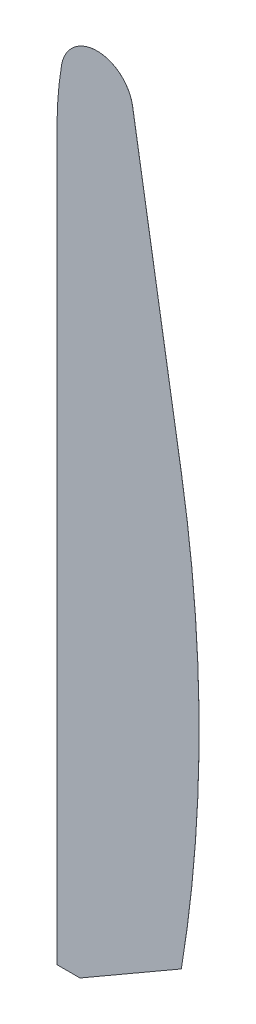
ISO-10303-21;
HEADER;
FILE_DESCRIPTION(('STEP AP214'),'2;1');
FILE_NAME('part.step','',(''),(''),'','','');
FILE_SCHEMA(('AUTOMOTIVE_DESIGN { 1 0 10303 214 1 1 1 1 }'));
ENDSEC;
DATA;
#1=APPLICATION_CONTEXT('core data for automotive mechanical design processes');
#2=APPLICATION_PROTOCOL_DEFINITION('international standard','automotive_design',2000,#1);
#3=PRODUCT_CONTEXT('',#1,'mechanical');
#4=PRODUCT('Part','Part','',(#3));
#5=PRODUCT_RELATED_PRODUCT_CATEGORY('part','',(#4));
#6=PRODUCT_DEFINITION_FORMATION('','',#4);
#7=PRODUCT_DEFINITION_CONTEXT('part definition',#1,'design');
#8=PRODUCT_DEFINITION('design','',#6,#7);
#9=PRODUCT_DEFINITION_SHAPE('','',#8);
#10=(LENGTH_UNIT() NAMED_UNIT(*) SI_UNIT(.MILLI.,.METRE.));
#11=(NAMED_UNIT(*) PLANE_ANGLE_UNIT() SI_UNIT($,.RADIAN.));
#12=(NAMED_UNIT(*) SI_UNIT($,.STERADIAN.) SOLID_ANGLE_UNIT());
#13=UNCERTAINTY_MEASURE_WITH_UNIT(LENGTH_MEASURE(1.E-05),#10,'distance_accuracy_value','');
#14=(GEOMETRIC_REPRESENTATION_CONTEXT(3) GLOBAL_UNCERTAINTY_ASSIGNED_CONTEXT((#13)) GLOBAL_UNIT_ASSIGNED_CONTEXT((#10,
#11,#12)) REPRESENTATION_CONTEXT('',''));
#15=CARTESIAN_POINT('',(0.,0.,0.));
#16=DIRECTION('',(0.,0.,1.));
#17=DIRECTION('',(1.,0.,0.));
#18=AXIS2_PLACEMENT_3D('',#15,#16,#17);
#19=CARTESIAN_POINT('',(8.71053174210325,168.714262265453,0.01));
#20=DIRECTION('',(0.,0.,-1.));
#21=DIRECTION('',(-1.,0.,0.));
#22=AXIS2_PLACEMENT_3D('',#19,#20,#21);
#23=CYLINDRICAL_SURFACE('',#22,7.83350913216335);
#24=CARTESIAN_POINT('',(8.71053174210325,168.714262265453,0.));
#25=DIRECTION('',(0.,0.,-1.));
#26=DIRECTION('',(-1.,0.,0.));
#27=AXIS2_PLACEMENT_3D('',#24,#25,#26);
#28=CIRCLE('',#27,7.83350913216335);
#29=CARTESIAN_POINT('',(0.983259014830762,170.,0.));
#30=VERTEX_POINT('',#29);
#31=CARTESIAN_POINT('',(16.4378044693758,170.,0.));
#32=VERTEX_POINT('',#31);
#33=EDGE_CURVE('E129',#30,#32,#28,.T.);
#34=ORIENTED_EDGE('',*,*,#33,.F.);
#35=DIRECTION('',(0.,0.,-1.));
#36=VECTOR('',#35,1.);
#37=CARTESIAN_POINT('',(0.983259014830762,170.,0.01));
#38=LINE('',#37,#36);
#39=CARTESIAN_POINT('',(0.983259014830762,170.,0.01));
#40=VERTEX_POINT('',#39);
#41=EDGE_CURVE('E11',#40,#30,#38,.T.);
#42=ORIENTED_EDGE('',*,*,#41,.F.);
#43=CARTESIAN_POINT('',(8.71053174210325,168.714262265453,0.01));
#44=DIRECTION('',(0.,0.,-1.));
#45=DIRECTION('',(-1.,0.,0.));
#46=AXIS2_PLACEMENT_3D('',#43,#44,#45);
#47=CIRCLE('',#46,7.83350913216335);
#48=CARTESIAN_POINT('',(16.4378044693758,170.,0.01));
#49=VERTEX_POINT('',#48);
#50=EDGE_CURVE('E144',#40,#49,#47,.T.);
#51=ORIENTED_EDGE('',*,*,#50,.T.);
#52=DIRECTION('',(0.,0.,-1.));
#53=VECTOR('',#52,1.);
#54=CARTESIAN_POINT('',(16.4378044693758,170.,0.01));
#55=LINE('',#54,#53);
#56=EDGE_CURVE('E42',#49,#32,#55,.T.);
#57=ORIENTED_EDGE('',*,*,#56,.T.);
#58=EDGE_LOOP('',(#34,#42,#51,#57));
#59=FACE_BOUND('',#58,.T.);
#60=ADVANCED_FACE('F41',(#59),#23,.T.);
#61=CARTESIAN_POINT('',(72.5021566747534,158.1,0.01));
#62=DIRECTION('',(0.,0.,-1.));
#63=DIRECTION('',(-1.,0.,0.));
#64=AXIS2_PLACEMENT_3D('',#61,#62,#63);
#65=CYLINDRICAL_SURFACE('',#64,72.5021566747534);
#66=CARTESIAN_POINT('',(72.5021566747534,158.1,0.));
#67=DIRECTION('',(0.,0.,-1.));
#68=DIRECTION('',(-1.,0.,0.));
#69=AXIS2_PLACEMENT_3D('',#66,#67,#68);
#70=CIRCLE('',#69,72.5021566747534);
#71=CARTESIAN_POINT('',(0.,158.1,0.));
#72=VERTEX_POINT('',#71);
#73=EDGE_CURVE('E141',#72,#30,#70,.T.);
#74=ORIENTED_EDGE('',*,*,#73,.F.);
#75=DIRECTION('',(0.,0.,-1.));
#76=VECTOR('',#75,1.);
#77=CARTESIAN_POINT('',(0.,158.1,0.01));
#78=LINE('',#77,#76);
#79=CARTESIAN_POINT('',(0.,158.1,0.01));
#80=VERTEX_POINT('',#79);
#81=EDGE_CURVE('E49',#80,#72,#78,.T.);
#82=ORIENTED_EDGE('',*,*,#81,.F.);
#83=CARTESIAN_POINT('',(72.5021566747534,158.1,0.01));
#84=DIRECTION('',(0.,0.,-1.));
#85=DIRECTION('',(-1.,0.,0.));
#86=AXIS2_PLACEMENT_3D('',#83,#84,#85);
#87=CIRCLE('',#86,72.5021566747534);
#88=EDGE_CURVE('E124',#80,#40,#87,.T.);
#89=ORIENTED_EDGE('',*,*,#88,.T.);
#90=ORIENTED_EDGE('',*,*,#41,.T.);
#91=EDGE_LOOP('',(#74,#82,#89,#90));
#92=FACE_BOUND('',#91,.T.);
#93=ADVANCED_FACE('F160',(#92),#65,.T.);
#94=CARTESIAN_POINT('',(0.,0.,0.01));
#95=DIRECTION('',(-1.,0.,0.));
#96=DIRECTION('',(0.,0.,1.));
#97=AXIS2_PLACEMENT_3D('',#94,#95,#96);
#98=PLANE('',#97);
#99=DIRECTION('',(0.,1.,0.));
#100=VECTOR('',#99,1.);
#101=CARTESIAN_POINT('',(0.,0.,0.));
#102=LINE('',#101,#100);
#103=CARTESIAN_POINT('',(0.,0.,0.));
#104=VERTEX_POINT('',#103);
#105=EDGE_CURVE('E109',#104,#72,#102,.T.);
#106=ORIENTED_EDGE('',*,*,#105,.F.);
#107=DIRECTION('',(0.,0.,-1.));
#108=VECTOR('',#107,1.);
#109=CARTESIAN_POINT('',(0.,0.,0.01));
#110=LINE('',#109,#108);
#111=CARTESIAN_POINT('',(0.,0.,0.01));
#112=VERTEX_POINT('',#111);
#113=EDGE_CURVE('E102',#112,#104,#110,.T.);
#114=ORIENTED_EDGE('',*,*,#113,.F.);
#115=DIRECTION('',(0.,1.,0.));
#116=VECTOR('',#115,1.);
#117=CARTESIAN_POINT('',(0.,0.,0.01));
#118=LINE('',#117,#116);
#119=EDGE_CURVE('E107',#112,#80,#118,.T.);
#120=ORIENTED_EDGE('',*,*,#119,.T.);
#121=ORIENTED_EDGE('',*,*,#81,.T.);
#122=EDGE_LOOP('',(#106,#114,#120,#121));
#123=FACE_BOUND('',#122,.T.);
#124=ADVANCED_FACE('F106',(#123),#98,.T.);
#125=CARTESIAN_POINT('',(0.,0.,0.01));
#126=DIRECTION('',(0.,1.,0.));
#127=DIRECTION('',(-1.,0.,0.));
#128=AXIS2_PLACEMENT_3D('',#125,#126,#127);
#129=PLANE('',#128);
#130=DIRECTION('',(1.,0.,0.));
#131=VECTOR('',#130,1.);
#132=CARTESIAN_POINT('',(0.,0.,0.));
#133=LINE('',#132,#131);
#134=CARTESIAN_POINT('',(5.,0.,0.));
#135=VERTEX_POINT('',#134);
#136=EDGE_CURVE('E136',#104,#135,#133,.T.);
#137=ORIENTED_EDGE('',*,*,#136,.T.);
#138=DIRECTION('',(0.,0.,-1.));
#139=VECTOR('',#138,1.);
#140=CARTESIAN_POINT('',(5.,0.,0.01));
#141=LINE('',#140,#139);
#142=CARTESIAN_POINT('',(5.,0.,0.01));
#143=VERTEX_POINT('',#142);
#144=EDGE_CURVE('E114',#143,#135,#141,.T.);
#145=ORIENTED_EDGE('',*,*,#144,.F.);
#146=DIRECTION('',(1.,0.,0.));
#147=VECTOR('',#146,1.);
#148=CARTESIAN_POINT('',(0.,0.,0.01));
#149=LINE('',#148,#147);
#150=EDGE_CURVE('E117',#112,#143,#149,.T.);
#151=ORIENTED_EDGE('',*,*,#150,.F.);
#152=ORIENTED_EDGE('',*,*,#113,.T.);
#153=EDGE_LOOP('',(#137,#145,#151,#152));
#154=FACE_BOUND('',#153,.T.);
#155=ADVANCED_FACE('F120',(#154),#129,.F.);
#156=CARTESIAN_POINT('',(5.,0.,0.01));
#157=DIRECTION('',(-0.500000000000001,0.866025403784438,0.));
#158=DIRECTION('',(-0.866025403784438,-0.500000000000001,0.));
#159=AXIS2_PLACEMENT_3D('',#156,#157,#158);
#160=PLANE('',#159);
#161=DIRECTION('',(0.866025403784438,0.500000000000001,0.));
#162=VECTOR('',#161,1.);
#163=CARTESIAN_POINT('',(5.,0.,0.));
#164=LINE('',#163,#162);
#165=CARTESIAN_POINT('',(27.0454545454537,12.7279491162252,0.));
#166=VERTEX_POINT('',#165);
#167=EDGE_CURVE('E138',#135,#166,#164,.T.);
#168=ORIENTED_EDGE('',*,*,#167,.T.);
#169=DIRECTION('',(0.,0.,-1.));
#170=VECTOR('',#169,1.);
#171=CARTESIAN_POINT('',(27.0454545454537,12.7279491162252,0.01));
#172=LINE('',#171,#170);
#173=CARTESIAN_POINT('',(27.0454545454537,12.7279491162252,0.01));
#174=VERTEX_POINT('',#173);
#175=EDGE_CURVE('E149',#174,#166,#172,.T.);
#176=ORIENTED_EDGE('',*,*,#175,.F.);
#177=DIRECTION('',(0.866025403784438,0.500000000000001,0.));
#178=VECTOR('',#177,1.);
#179=CARTESIAN_POINT('',(5.,0.,0.01));
#180=LINE('',#179,#178);
#181=EDGE_CURVE('E122',#143,#174,#180,.T.);
#182=ORIENTED_EDGE('',*,*,#181,.F.);
#183=ORIENTED_EDGE('',*,*,#144,.T.);
#184=EDGE_LOOP('',(#168,#176,#182,#183));
#185=FACE_BOUND('',#184,.T.);
#186=ADVANCED_FACE('F168',(#185),#160,.F.);
#187=CARTESIAN_POINT('',(-253.982239600511,59.4880316924282,0.01));
#188=DIRECTION('',(0.,0.,-1.));
#189=DIRECTION('',(-1.,0.,0.));
#190=AXIS2_PLACEMENT_3D('',#187,#188,#189);
#191=CYLINDRICAL_SURFACE('',#190,284.891330509602);
#192=CARTESIAN_POINT('',(-253.982239600511,59.4880316924282,0.));
#193=DIRECTION('',(0.,0.,1.));
#194=DIRECTION('',(1.,0.,0.));
#195=AXIS2_PLACEMENT_3D('',#192,#193,#194);
#196=CIRCLE('',#195,284.891330509602);
#197=CARTESIAN_POINT('',(27.0454545454537,106.248114268631,0.));
#198=VERTEX_POINT('',#197);
#199=EDGE_CURVE('E133',#166,#198,#196,.T.);
#200=ORIENTED_EDGE('',*,*,#199,.T.);
#201=DIRECTION('',(0.,0.,-1.));
#202=VECTOR('',#201,1.);
#203=CARTESIAN_POINT('',(27.0454545454537,106.248114268631,0.01));
#204=LINE('',#203,#202);
#205=CARTESIAN_POINT('',(27.0454545454537,106.248114268631,0.01));
#206=VERTEX_POINT('',#205);
#207=EDGE_CURVE('E151',#206,#198,#204,.T.);
#208=ORIENTED_EDGE('',*,*,#207,.F.);
#209=CARTESIAN_POINT('',(-253.982239600511,59.4880316924282,0.01));
#210=DIRECTION('',(0.,0.,1.));
#211=DIRECTION('',(1.,0.,0.));
#212=AXIS2_PLACEMENT_3D('',#209,#210,#211);
#213=CIRCLE('',#212,284.891330509602);
#214=EDGE_CURVE('E231',#174,#206,#213,.T.);
#215=ORIENTED_EDGE('',*,*,#214,.F.);
#216=ORIENTED_EDGE('',*,*,#175,.T.);
#217=EDGE_LOOP('',(#200,#208,#215,#216));
#218=FACE_BOUND('',#217,.T.);
#219=ADVANCED_FACE('F174',(#218),#191,.T.);
#220=CARTESIAN_POINT('',(16.4378044693758,170.,0.01));
#221=DIRECTION('',(0.986438210117781,0.164133048529629,0.));
#222=DIRECTION('',(-0.164133048529629,0.986438210117781,0.));
#223=AXIS2_PLACEMENT_3D('',#220,#221,#222);
#224=PLANE('',#223);
#225=DIRECTION('',(0.164133048529629,-0.98643821011778,0.));
#226=VECTOR('',#225,1.);
#227=CARTESIAN_POINT('',(16.4378044693758,170.,0.));
#228=LINE('',#227,#226);
#229=EDGE_CURVE('E135',#32,#198,#228,.T.);
#230=ORIENTED_EDGE('',*,*,#229,.F.);
#231=ORIENTED_EDGE('',*,*,#56,.F.);
#232=DIRECTION('',(0.164133048529629,-0.98643821011778,0.));
#233=VECTOR('',#232,1.);
#234=CARTESIAN_POINT('',(16.4378044693758,170.,0.01));
#235=LINE('',#234,#233);
#236=EDGE_CURVE('E237',#49,#206,#235,.T.);
#237=ORIENTED_EDGE('',*,*,#236,.T.);
#238=ORIENTED_EDGE('',*,*,#207,.T.);
#239=EDGE_LOOP('',(#230,#231,#237,#238));
#240=FACE_BOUND('',#239,.T.);
#241=ADVANCED_FACE('F153',(#240),#224,.T.);
#242=CARTESIAN_POINT('',(8.71053174210325,168.714262265453,0.01));
#243=DIRECTION('',(0.,0.,-1.));
#244=DIRECTION('',(-1.,0.,0.));
#245=AXIS2_PLACEMENT_3D('',#242,#243,#244);
#246=PLANE('',#245);
#247=ORIENTED_EDGE('',*,*,#50,.F.);
#248=ORIENTED_EDGE('',*,*,#88,.F.);
#249=ORIENTED_EDGE('',*,*,#119,.F.);
#250=ORIENTED_EDGE('',*,*,#150,.T.);
#251=ORIENTED_EDGE('',*,*,#181,.T.);
#252=ORIENTED_EDGE('',*,*,#214,.T.);
#253=ORIENTED_EDGE('',*,*,#236,.F.);
#254=EDGE_LOOP('',(#247,#248,#249,#250,#251,#252,#253));
#255=FACE_BOUND('',#254,.T.);
#256=ADVANCED_FACE('F123',(#255),#246,.F.);
#257=CARTESIAN_POINT('',(8.71053174210325,168.714262265453,0.));
#258=DIRECTION('',(0.,0.,-1.));
#259=DIRECTION('',(-1.,0.,0.));
#260=AXIS2_PLACEMENT_3D('',#257,#258,#259);
#261=PLANE('',#260);
#262=ORIENTED_EDGE('',*,*,#33,.T.);
#263=ORIENTED_EDGE('',*,*,#229,.T.);
#264=ORIENTED_EDGE('',*,*,#199,.F.);
#265=ORIENTED_EDGE('',*,*,#167,.F.);
#266=ORIENTED_EDGE('',*,*,#136,.F.);
#267=ORIENTED_EDGE('',*,*,#105,.T.);
#268=ORIENTED_EDGE('',*,*,#73,.T.);
#269=EDGE_LOOP('',(#262,#263,#264,#265,#266,#267,#268));
#270=FACE_BOUND('',#269,.T.);
#271=ADVANCED_FACE('F156',(#270),#261,.T.);
#272=CLOSED_SHELL('',(#60,#93,#124,#155,#186,#219,#241,#256,#271));
#273=MANIFOLD_SOLID_BREP('B2',#272);
#274=ADVANCED_BREP_SHAPE_REPRESENTATION('',(#18,#273),#14);
#275=SHAPE_DEFINITION_REPRESENTATION(#9,#274);
ENDSEC;
END-ISO-10303-21;
